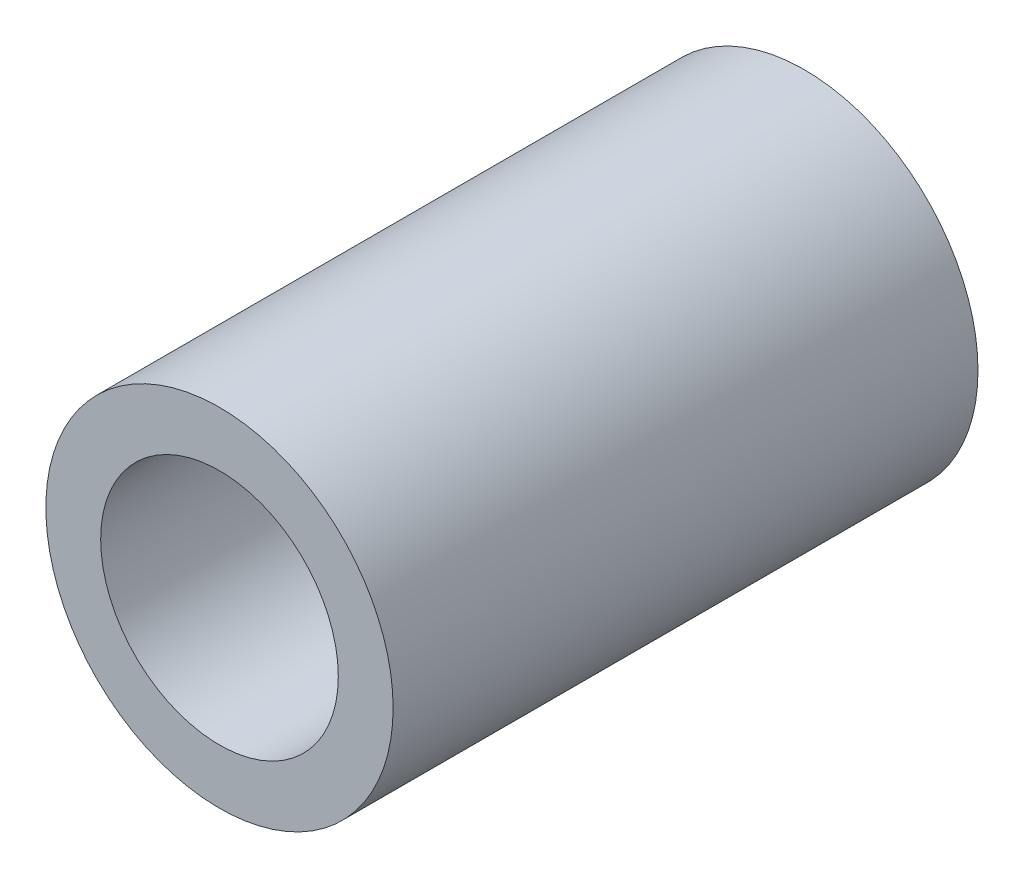
ISO-10303-21;
HEADER;
FILE_DESCRIPTION(('STEP AP214'),'2;1');
FILE_NAME('part.step','',(''),(''),'','','');
FILE_SCHEMA(('AUTOMOTIVE_DESIGN { 1 0 10303 214 1 1 1 1 }'));
ENDSEC;
DATA;
#1=APPLICATION_CONTEXT('core data for automotive mechanical design processes');
#2=APPLICATION_PROTOCOL_DEFINITION('international standard','automotive_design',2000,#1);
#3=PRODUCT_CONTEXT('',#1,'mechanical');
#4=PRODUCT('Part','Part','',(#3));
#5=PRODUCT_RELATED_PRODUCT_CATEGORY('part','',(#4));
#6=PRODUCT_DEFINITION_FORMATION('','',#4);
#7=PRODUCT_DEFINITION_CONTEXT('part definition',#1,'design');
#8=PRODUCT_DEFINITION('design','',#6,#7);
#9=PRODUCT_DEFINITION_SHAPE('','',#8);
#10=(LENGTH_UNIT() NAMED_UNIT(*) SI_UNIT(.MILLI.,.METRE.));
#11=(NAMED_UNIT(*) PLANE_ANGLE_UNIT() SI_UNIT($,.RADIAN.));
#12=(NAMED_UNIT(*) SI_UNIT($,.STERADIAN.) SOLID_ANGLE_UNIT());
#13=UNCERTAINTY_MEASURE_WITH_UNIT(LENGTH_MEASURE(1.E-05),#10,'distance_accuracy_value','');
#14=(GEOMETRIC_REPRESENTATION_CONTEXT(3) GLOBAL_UNCERTAINTY_ASSIGNED_CONTEXT((#13)) GLOBAL_UNIT_ASSIGNED_CONTEXT((#10,
#11,#12)) REPRESENTATION_CONTEXT('',''));
#15=CARTESIAN_POINT('',(0.,0.,0.));
#16=DIRECTION('',(0.,0.,1.));
#17=DIRECTION('',(1.,0.,0.));
#18=AXIS2_PLACEMENT_3D('',#15,#16,#17);
#19=CARTESIAN_POINT('',(0.,0.,16.));
#20=DIRECTION('',(0.,0.,1.));
#21=DIRECTION('',(1.,0.,0.));
#22=AXIS2_PLACEMENT_3D('',#19,#20,#21);
#23=PLANE('',#22);
#24=CARTESIAN_POINT('',(0.,0.,16.));
#25=DIRECTION('',(0.,0.,1.));
#26=DIRECTION('',(1.,0.,0.));
#27=AXIS2_PLACEMENT_3D('',#24,#25,#26);
#28=CIRCLE('',#27,4.75);
#29=CARTESIAN_POINT('',(4.75,0.,16.));
#30=VERTEX_POINT('',#29);
#31=EDGE_CURVE('E10',#30,#30,#28,.T.);
#32=ORIENTED_EDGE('',*,*,#31,.T.);
#33=EDGE_LOOP('',(#32));
#34=FACE_BOUND('',#33,.T.);
#35=CARTESIAN_POINT('',(0.,0.,16.));
#36=DIRECTION('',(0.,0.,1.));
#37=DIRECTION('',(1.,0.,0.));
#38=AXIS2_PLACEMENT_3D('',#35,#36,#37);
#39=CIRCLE('',#38,3.25);
#40=CARTESIAN_POINT('',(3.25,0.,16.));
#41=VERTEX_POINT('',#40);
#42=EDGE_CURVE('E56',#41,#41,#39,.T.);
#43=ORIENTED_EDGE('',*,*,#42,.F.);
#44=EDGE_LOOP('',(#43));
#45=FACE_BOUND('',#44,.T.);
#46=ADVANCED_FACE('F45',(#34,#45),#23,.T.);
#47=CARTESIAN_POINT('',(0.,0.,0.));
#48=DIRECTION('',(0.,0.,1.));
#49=DIRECTION('',(1.,0.,0.));
#50=AXIS2_PLACEMENT_3D('',#47,#48,#49);
#51=PLANE('',#50);
#52=CARTESIAN_POINT('',(0.,0.,0.));
#53=DIRECTION('',(0.,0.,1.));
#54=DIRECTION('',(1.,0.,0.));
#55=AXIS2_PLACEMENT_3D('',#52,#53,#54);
#56=CIRCLE('',#55,4.75);
#57=CARTESIAN_POINT('',(4.75,0.,0.));
#58=VERTEX_POINT('',#57);
#59=EDGE_CURVE('E49',#58,#58,#56,.T.);
#60=ORIENTED_EDGE('',*,*,#59,.F.);
#61=EDGE_LOOP('',(#60));
#62=FACE_BOUND('',#61,.T.);
#63=CARTESIAN_POINT('',(0.,0.,0.));
#64=DIRECTION('',(0.,0.,1.));
#65=DIRECTION('',(1.,0.,0.));
#66=AXIS2_PLACEMENT_3D('',#63,#64,#65);
#67=CIRCLE('',#66,3.25);
#68=CARTESIAN_POINT('',(3.25,0.,0.));
#69=VERTEX_POINT('',#68);
#70=EDGE_CURVE('E58',#69,#69,#67,.T.);
#71=ORIENTED_EDGE('',*,*,#70,.T.);
#72=EDGE_LOOP('',(#71));
#73=FACE_BOUND('',#72,.T.);
#74=ADVANCED_FACE('F68',(#62,#73),#51,.F.);
#75=CARTESIAN_POINT('',(0.,0.,16.));
#76=DIRECTION('',(0.,0.,-1.));
#77=DIRECTION('',(-1.,0.,0.));
#78=AXIS2_PLACEMENT_3D('',#75,#76,#77);
#79=CYLINDRICAL_SURFACE('',#78,4.75);
#80=ORIENTED_EDGE('',*,*,#31,.F.);
#81=EDGE_LOOP('',(#80));
#82=FACE_BOUND('',#81,.T.);
#83=ORIENTED_EDGE('',*,*,#59,.T.);
#84=EDGE_LOOP('',(#83));
#85=FACE_BOUND('',#84,.T.);
#86=ADVANCED_FACE('F47',(#82,#85),#79,.T.);
#87=CARTESIAN_POINT('',(0.,0.,16.));
#88=DIRECTION('',(0.,0.,-1.));
#89=DIRECTION('',(-1.,0.,0.));
#90=AXIS2_PLACEMENT_3D('',#87,#88,#89);
#91=CYLINDRICAL_SURFACE('',#90,3.25);
#92=ORIENTED_EDGE('',*,*,#42,.T.);
#93=EDGE_LOOP('',(#92));
#94=FACE_BOUND('',#93,.T.);
#95=ORIENTED_EDGE('',*,*,#70,.F.);
#96=EDGE_LOOP('',(#95));
#97=FACE_BOUND('',#96,.T.);
#98=ADVANCED_FACE('F64',(#94,#97),#91,.F.);
#99=CLOSED_SHELL('',(#46,#74,#86,#98));
#100=MANIFOLD_SOLID_BREP('B2',#99);
#101=ADVANCED_BREP_SHAPE_REPRESENTATION('',(#18,#100),#14);
#102=SHAPE_DEFINITION_REPRESENTATION(#9,#101);
ENDSEC;
END-ISO-10303-21;
